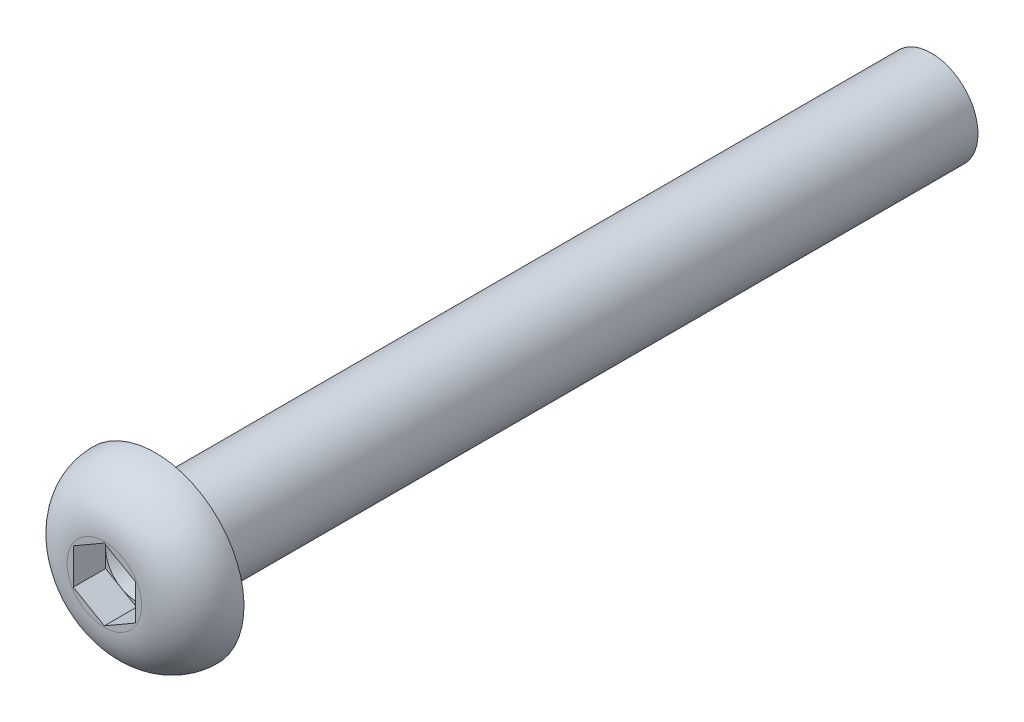
ISO-10303-21;
HEADER;
FILE_DESCRIPTION(('STEP AP214'),'2;1');
FILE_NAME('part.step','',(''),(''),'','','');
FILE_SCHEMA(('AUTOMOTIVE_DESIGN { 1 0 10303 214 1 1 1 1 }'));
ENDSEC;
DATA;
#1=APPLICATION_CONTEXT('core data for automotive mechanical design processes');
#2=APPLICATION_PROTOCOL_DEFINITION('international standard','automotive_design',2000,#1);
#3=PRODUCT_CONTEXT('',#1,'mechanical');
#4=PRODUCT('Part','Part','',(#3));
#5=PRODUCT_RELATED_PRODUCT_CATEGORY('part','',(#4));
#6=PRODUCT_DEFINITION_FORMATION('','',#4);
#7=PRODUCT_DEFINITION_CONTEXT('part definition',#1,'design');
#8=PRODUCT_DEFINITION('design','',#6,#7);
#9=PRODUCT_DEFINITION_SHAPE('','',#8);
#10=(LENGTH_UNIT() NAMED_UNIT(*) SI_UNIT(.MILLI.,.METRE.));
#11=(NAMED_UNIT(*) PLANE_ANGLE_UNIT() SI_UNIT($,.RADIAN.));
#12=(NAMED_UNIT(*) SI_UNIT($,.STERADIAN.) SOLID_ANGLE_UNIT());
#13=UNCERTAINTY_MEASURE_WITH_UNIT(LENGTH_MEASURE(1.E-05),#10,'distance_accuracy_value','');
#14=(GEOMETRIC_REPRESENTATION_CONTEXT(3) GLOBAL_UNCERTAINTY_ASSIGNED_CONTEXT((#13)) GLOBAL_UNIT_ASSIGNED_CONTEXT((#10,
#11,#12)) REPRESENTATION_CONTEXT('',''));
#15=CARTESIAN_POINT('',(0.,0.,0.));
#16=DIRECTION('',(0.,0.,1.));
#17=DIRECTION('',(1.,0.,0.));
#18=AXIS2_PLACEMENT_3D('',#15,#16,#17);
#19=CARTESIAN_POINT('',(0.,0.,-0.1));
#20=DIRECTION('',(0.,0.,-1.));
#21=DIRECTION('',(0.,-1.,0.));
#22=AXIS2_PLACEMENT_3D('',#19,#20,#21);
#23=TOROIDAL_SURFACE('',#22,1.6,0.1);
#24=CARTESIAN_POINT('',(0.,0.,-0.1));
#25=DIRECTION('',(0.,0.,1.));
#26=DIRECTION('',(1.,0.,0.));
#27=AXIS2_PLACEMENT_3D('',#24,#25,#26);
#28=CIRCLE('',#27,1.5);
#29=CARTESIAN_POINT('',(1.5,0.,-0.1));
#30=VERTEX_POINT('',#29);
#31=EDGE_CURVE('E411',#30,#30,#28,.T.);
#32=ORIENTED_EDGE('',*,*,#31,.T.);
#33=EDGE_LOOP('',(#32));
#34=FACE_BOUND('',#33,.T.);
#35=CARTESIAN_POINT('',(0.,0.,0.));
#36=DIRECTION('',(0.,0.,-1.));
#37=DIRECTION('',(0.,-1.,0.));
#38=AXIS2_PLACEMENT_3D('',#35,#36,#37);
#39=CIRCLE('',#38,1.6);
#40=CARTESIAN_POINT('',(0.,-1.6,0.));
#41=VERTEX_POINT('',#40);
#42=EDGE_CURVE('E11',#41,#41,#39,.T.);
#43=ORIENTED_EDGE('',*,*,#42,.T.);
#44=EDGE_LOOP('',(#43));
#45=FACE_BOUND('',#44,.T.);
#46=ADVANCED_FACE('F54',(#34,#45),#23,.F.);
#47=CARTESIAN_POINT('',(0.,0.,0.));
#48=DIRECTION('',(0.,0.,-1.));
#49=DIRECTION('',(0.,-1.,0.));
#50=AXIS2_PLACEMENT_3D('',#47,#48,#49);
#51=PLANE('',#50);
#52=ORIENTED_EDGE('',*,*,#42,.F.);
#53=EDGE_LOOP('',(#52));
#54=FACE_BOUND('',#53,.T.);
#55=CARTESIAN_POINT('',(0.,0.,0.));
#56=DIRECTION('',(0.,0.,-1.));
#57=DIRECTION('',(0.,-1.,0.));
#58=AXIS2_PLACEMENT_3D('',#55,#56,#57);
#59=CIRCLE('',#58,2.85);
#60=CARTESIAN_POINT('',(0.,-2.85,0.));
#61=VERTEX_POINT('',#60);
#62=EDGE_CURVE('E65',#61,#61,#59,.T.);
#63=ORIENTED_EDGE('',*,*,#62,.T.);
#64=EDGE_LOOP('',(#63));
#65=FACE_BOUND('',#64,.T.);
#66=ADVANCED_FACE('F238',(#54,#65),#51,.T.);
#67=CARTESIAN_POINT('',(0.,0.,-2.1325005253703E-13));
#68=DIRECTION('',(0.,0.,-1.));
#69=DIRECTION('',(0.,-1.,0.));
#70=AXIS2_PLACEMENT_3D('',#67,#68,#69);
#71=DEGENERATE_TOROIDAL_SURFACE('',#70,1.19999999999978,1.65000000000022,.T.);
#72=ORIENTED_EDGE('',*,*,#62,.F.);
#73=EDGE_LOOP('',(#72));
#74=FACE_BOUND('',#73,.T.);
#75=CARTESIAN_POINT('',(0.,0.,1.65));
#76=DIRECTION('',(0.,0.,-1.));
#77=DIRECTION('',(0.,-1.,0.));
#78=AXIS2_PLACEMENT_3D('',#75,#76,#77);
#79=CIRCLE('',#78,1.19999999999978);
#80=CARTESIAN_POINT('',(0.,-1.19999999999978,1.65));
#81=VERTEX_POINT('',#80);
#82=EDGE_CURVE('E221',#81,#81,#79,.T.);
#83=ORIENTED_EDGE('',*,*,#82,.T.);
#84=EDGE_LOOP('',(#83));
#85=FACE_BOUND('',#84,.T.);
#86=ADVANCED_FACE('F241',(#74,#85),#71,.T.);
#87=CARTESIAN_POINT('',(0.,0.,1.65));
#88=DIRECTION('',(0.,0.,1.));
#89=DIRECTION('',(0.,-1.,0.));
#90=AXIS2_PLACEMENT_3D('',#87,#88,#89);
#91=PLANE('',#90);
#92=DIRECTION('',(-0.866025403784439,-0.5,0.));
#93=VECTOR('',#92,1.);
#94=CARTESIAN_POINT('',(0.,1.15470053837925,1.65));
#95=LINE('',#94,#93);
#96=CARTESIAN_POINT('',(0.,1.15470053837925,1.65));
#97=VERTEX_POINT('',#96);
#98=CARTESIAN_POINT('',(-1.,0.577350269189626,1.65));
#99=VERTEX_POINT('',#98);
#100=EDGE_CURVE('E206',#97,#99,#95,.T.);
#101=ORIENTED_EDGE('',*,*,#100,.F.);
#102=DIRECTION('',(-0.86602540378444,0.5,0.));
#103=VECTOR('',#102,1.);
#104=CARTESIAN_POINT('',(1.,0.577350269189627,1.65));
#105=LINE('',#104,#103);
#106=CARTESIAN_POINT('',(1.,0.577350269189627,1.65));
#107=VERTEX_POINT('',#106);
#108=EDGE_CURVE('E194',#107,#97,#105,.T.);
#109=ORIENTED_EDGE('',*,*,#108,.F.);
#110=DIRECTION('',(0.,1.,0.));
#111=VECTOR('',#110,1.);
#112=CARTESIAN_POINT('',(1.,-0.577350269189625,1.65));
#113=LINE('',#112,#111);
#114=CARTESIAN_POINT('',(1.,-0.577350269189623,1.65));
#115=VERTEX_POINT('',#114);
#116=EDGE_CURVE('E217',#115,#107,#113,.T.);
#117=ORIENTED_EDGE('',*,*,#116,.F.);
#118=DIRECTION('',(0.866025403784438,0.5,0.));
#119=VECTOR('',#118,1.);
#120=CARTESIAN_POINT('',(0.,-1.15470053837925,1.65));
#121=LINE('',#120,#119);
#122=CARTESIAN_POINT('',(0.,-1.15470053837925,1.65));
#123=VERTEX_POINT('',#122);
#124=EDGE_CURVE('E154',#123,#115,#121,.T.);
#125=ORIENTED_EDGE('',*,*,#124,.F.);
#126=DIRECTION('',(0.866025403784438,-0.5,0.));
#127=VECTOR('',#126,1.);
#128=CARTESIAN_POINT('',(-1.,-0.577350269189625,1.65));
#129=LINE('',#128,#127);
#130=CARTESIAN_POINT('',(-1.,-0.577350269189625,1.65));
#131=VERTEX_POINT('',#130);
#132=EDGE_CURVE('E155',#131,#123,#129,.T.);
#133=ORIENTED_EDGE('',*,*,#132,.F.);
#134=DIRECTION('',(0.,-1.,0.));
#135=VECTOR('',#134,1.);
#136=CARTESIAN_POINT('',(-1.,0.577350269189627,1.65));
#137=LINE('',#136,#135);
#138=EDGE_CURVE('E187',#99,#131,#137,.T.);
#139=ORIENTED_EDGE('',*,*,#138,.F.);
#140=EDGE_LOOP('',(#101,#109,#117,#125,#133,#139));
#141=FACE_BOUND('',#140,.T.);
#142=ORIENTED_EDGE('',*,*,#82,.F.);
#143=EDGE_LOOP('',(#142));
#144=FACE_BOUND('',#143,.T.);
#145=ADVANCED_FACE('F242',(#141,#144),#91,.T.);
#146=CARTESIAN_POINT('',(0.,-1.15470053837925,0.61));
#147=DIRECTION('',(0.5,-0.866025403784438,0.));
#148=DIRECTION('',(0.866025403784438,0.5,0.));
#149=AXIS2_PLACEMENT_3D('',#146,#147,#148);
#150=PLANE('',#149);
#151=ORIENTED_EDGE('',*,*,#124,.T.);
#152=DIRECTION('',(0.,0.,1.));
#153=VECTOR('',#152,1.);
#154=CARTESIAN_POINT('',(1.,-0.577350269189625,0.61));
#155=LINE('',#154,#153);
#156=CARTESIAN_POINT('',(1.,-0.577350269189625,0.61));
#157=VERTEX_POINT('',#156);
#158=EDGE_CURVE('E191',#157,#115,#155,.T.);
#159=ORIENTED_EDGE('',*,*,#158,.F.);
#160=DIRECTION('',(0.866025403784438,0.5,0.));
#161=VECTOR('',#160,1.);
#162=CARTESIAN_POINT('',(0.5,-0.866025403784438,0.61));
#163=LINE('',#162,#161);
#164=CARTESIAN_POINT('',(0.5,-0.866025403784438,0.61));
#165=VERTEX_POINT('',#164);
#166=EDGE_CURVE('E161',#165,#157,#163,.T.);
#167=ORIENTED_EDGE('',*,*,#166,.F.);
#168=DIRECTION('',(0.866025403784438,0.5,0.));
#169=VECTOR('',#168,1.);
#170=CARTESIAN_POINT('',(0.,-1.15470053837925,0.61));
#171=LINE('',#170,#169);
#172=CARTESIAN_POINT('',(0.,-1.15470053837925,0.61));
#173=VERTEX_POINT('',#172);
#174=EDGE_CURVE('E158',#173,#165,#171,.T.);
#175=ORIENTED_EDGE('',*,*,#174,.F.);
#176=DIRECTION('',(0.,0.,1.));
#177=VECTOR('',#176,1.);
#178=CARTESIAN_POINT('',(0.,-1.15470053837925,0.61));
#179=LINE('',#178,#177);
#180=EDGE_CURVE('E146',#173,#123,#179,.T.);
#181=ORIENTED_EDGE('',*,*,#180,.T.);
#182=EDGE_LOOP('',(#151,#159,#167,#175,#181));
#183=FACE_BOUND('',#182,.T.);
#184=ADVANCED_FACE('F157',(#183),#150,.F.);
#185=CARTESIAN_POINT('',(-1.,-0.577350269189625,0.61));
#186=DIRECTION('',(-0.5,-0.866025403784438,0.));
#187=DIRECTION('',(0.866025403784438,-0.5,0.));
#188=AXIS2_PLACEMENT_3D('',#185,#186,#187);
#189=PLANE('',#188);
#190=ORIENTED_EDGE('',*,*,#132,.T.);
#191=ORIENTED_EDGE('',*,*,#180,.F.);
#192=DIRECTION('',(0.866025403784438,-0.5,0.));
#193=VECTOR('',#192,1.);
#194=CARTESIAN_POINT('',(-0.5,-0.866025403784438,0.61));
#195=LINE('',#194,#193);
#196=CARTESIAN_POINT('',(-0.5,-0.866025403784438,0.61));
#197=VERTEX_POINT('',#196);
#198=EDGE_CURVE('E133',#197,#173,#195,.T.);
#199=ORIENTED_EDGE('',*,*,#198,.F.);
#200=DIRECTION('',(0.866025403784438,-0.5,0.));
#201=VECTOR('',#200,1.);
#202=CARTESIAN_POINT('',(-1.,-0.577350269189625,0.61));
#203=LINE('',#202,#201);
#204=CARTESIAN_POINT('',(-1.,-0.577350269189625,0.61));
#205=VERTEX_POINT('',#204);
#206=EDGE_CURVE('E175',#205,#197,#203,.T.);
#207=ORIENTED_EDGE('',*,*,#206,.F.);
#208=DIRECTION('',(0.,0.,1.));
#209=VECTOR('',#208,1.);
#210=CARTESIAN_POINT('',(-1.,-0.577350269189625,0.61));
#211=LINE('',#210,#209);
#212=EDGE_CURVE('E123',#205,#131,#211,.T.);
#213=ORIENTED_EDGE('',*,*,#212,.T.);
#214=EDGE_LOOP('',(#190,#191,#199,#207,#213));
#215=FACE_BOUND('',#214,.T.);
#216=ADVANCED_FACE('F147',(#215),#189,.F.);
#217=CARTESIAN_POINT('',(-1.,0.577350269189627,0.61));
#218=DIRECTION('',(-1.,0.,0.));
#219=DIRECTION('',(0.,-1.,0.));
#220=AXIS2_PLACEMENT_3D('',#217,#218,#219);
#221=PLANE('',#220);
#222=ORIENTED_EDGE('',*,*,#138,.T.);
#223=ORIENTED_EDGE('',*,*,#212,.F.);
#224=DIRECTION('',(0.,-1.,0.));
#225=VECTOR('',#224,1.);
#226=CARTESIAN_POINT('',(-1.,0.,0.61));
#227=LINE('',#226,#225);
#228=CARTESIAN_POINT('',(-1.,0.,0.61));
#229=VERTEX_POINT('',#228);
#230=EDGE_CURVE('E183',#229,#205,#227,.T.);
#231=ORIENTED_EDGE('',*,*,#230,.F.);
#232=DIRECTION('',(0.,-1.,0.));
#233=VECTOR('',#232,1.);
#234=CARTESIAN_POINT('',(-1.,0.577350269189627,0.61));
#235=LINE('',#234,#233);
#236=CARTESIAN_POINT('',(-1.,0.577350269189627,0.61));
#237=VERTEX_POINT('',#236);
#238=EDGE_CURVE('E302',#237,#229,#235,.T.);
#239=ORIENTED_EDGE('',*,*,#238,.F.);
#240=DIRECTION('',(0.,0.,1.));
#241=VECTOR('',#240,1.);
#242=CARTESIAN_POINT('',(-1.,0.577350269189627,0.61));
#243=LINE('',#242,#241);
#244=EDGE_CURVE('E178',#237,#99,#243,.T.);
#245=ORIENTED_EDGE('',*,*,#244,.T.);
#246=EDGE_LOOP('',(#222,#223,#231,#239,#245));
#247=FACE_BOUND('',#246,.T.);
#248=ADVANCED_FACE('F60',(#247),#221,.F.);
#249=CARTESIAN_POINT('',(0.,1.15470053837925,0.61));
#250=DIRECTION('',(-0.5,0.866025403784439,0.));
#251=DIRECTION('',(-0.866025403784439,-0.5,0.));
#252=AXIS2_PLACEMENT_3D('',#249,#250,#251);
#253=PLANE('',#252);
#254=ORIENTED_EDGE('',*,*,#100,.T.);
#255=ORIENTED_EDGE('',*,*,#244,.F.);
#256=DIRECTION('',(-0.866025403784439,-0.5,0.));
#257=VECTOR('',#256,1.);
#258=CARTESIAN_POINT('',(-0.5,0.866025403784439,0.61));
#259=LINE('',#258,#257);
#260=CARTESIAN_POINT('',(-0.5,0.866025403784439,0.61));
#261=VERTEX_POINT('',#260);
#262=EDGE_CURVE('E297',#261,#237,#259,.T.);
#263=ORIENTED_EDGE('',*,*,#262,.F.);
#264=DIRECTION('',(-0.866025403784439,-0.5,0.));
#265=VECTOR('',#264,1.);
#266=CARTESIAN_POINT('',(0.,1.15470053837925,0.61));
#267=LINE('',#266,#265);
#268=CARTESIAN_POINT('',(0.,1.15470053837925,0.61));
#269=VERTEX_POINT('',#268);
#270=EDGE_CURVE('E306',#269,#261,#267,.T.);
#271=ORIENTED_EDGE('',*,*,#270,.F.);
#272=DIRECTION('',(0.,0.,1.));
#273=VECTOR('',#272,1.);
#274=CARTESIAN_POINT('',(0.,1.15470053837925,0.61));
#275=LINE('',#274,#273);
#276=EDGE_CURVE('E209',#269,#97,#275,.T.);
#277=ORIENTED_EDGE('',*,*,#276,.T.);
#278=EDGE_LOOP('',(#254,#255,#263,#271,#277));
#279=FACE_BOUND('',#278,.T.);
#280=ADVANCED_FACE('F278',(#279),#253,.F.);
#281=CARTESIAN_POINT('',(1.,0.577350269189627,0.61));
#282=DIRECTION('',(0.5,0.86602540378444,0.));
#283=DIRECTION('',(-0.86602540378444,0.5,0.));
#284=AXIS2_PLACEMENT_3D('',#281,#282,#283);
#285=PLANE('',#284);
#286=ORIENTED_EDGE('',*,*,#108,.T.);
#287=ORIENTED_EDGE('',*,*,#276,.F.);
#288=DIRECTION('',(-0.86602540378444,0.5,0.));
#289=VECTOR('',#288,1.);
#290=CARTESIAN_POINT('',(0.5,0.86602540378444,0.61));
#291=LINE('',#290,#289);
#292=CARTESIAN_POINT('',(0.5,0.86602540378444,0.61));
#293=VERTEX_POINT('',#292);
#294=EDGE_CURVE('E315',#293,#269,#291,.T.);
#295=ORIENTED_EDGE('',*,*,#294,.F.);
#296=DIRECTION('',(-0.86602540378444,0.5,0.));
#297=VECTOR('',#296,1.);
#298=CARTESIAN_POINT('',(1.,0.577350269189627,0.61));
#299=LINE('',#298,#297);
#300=CARTESIAN_POINT('',(1.,0.577350269189627,0.61));
#301=VERTEX_POINT('',#300);
#302=EDGE_CURVE('E292',#301,#293,#299,.T.);
#303=ORIENTED_EDGE('',*,*,#302,.F.);
#304=DIRECTION('',(0.,0.,1.));
#305=VECTOR('',#304,1.);
#306=CARTESIAN_POINT('',(1.,0.577350269189627,0.61));
#307=LINE('',#306,#305);
#308=EDGE_CURVE('E198',#301,#107,#307,.T.);
#309=ORIENTED_EDGE('',*,*,#308,.T.);
#310=EDGE_LOOP('',(#286,#287,#295,#303,#309));
#311=FACE_BOUND('',#310,.T.);
#312=ADVANCED_FACE('F271',(#311),#285,.F.);
#313=CARTESIAN_POINT('',(1.,-0.577350269189625,0.61));
#314=DIRECTION('',(1.,0.,0.));
#315=DIRECTION('',(0.,1.,0.));
#316=AXIS2_PLACEMENT_3D('',#313,#314,#315);
#317=PLANE('',#316);
#318=ORIENTED_EDGE('',*,*,#116,.T.);
#319=ORIENTED_EDGE('',*,*,#308,.F.);
#320=DIRECTION('',(0.,1.,0.));
#321=VECTOR('',#320,1.);
#322=CARTESIAN_POINT('',(1.,0.,0.61));
#323=LINE('',#322,#321);
#324=CARTESIAN_POINT('',(1.,0.,0.61));
#325=VERTEX_POINT('',#324);
#326=EDGE_CURVE('E346',#325,#301,#323,.T.);
#327=ORIENTED_EDGE('',*,*,#326,.F.);
#328=DIRECTION('',(0.,1.,0.));
#329=VECTOR('',#328,1.);
#330=CARTESIAN_POINT('',(1.,-0.577350269189625,0.61));
#331=LINE('',#330,#329);
#332=EDGE_CURVE('E200',#157,#325,#331,.T.);
#333=ORIENTED_EDGE('',*,*,#332,.F.);
#334=ORIENTED_EDGE('',*,*,#158,.T.);
#335=EDGE_LOOP('',(#318,#319,#327,#333,#334));
#336=FACE_BOUND('',#335,.T.);
#337=ADVANCED_FACE('F268',(#336),#317,.F.);
#338=CARTESIAN_POINT('',(0.,0.,0.321324865405187));
#339=DIRECTION('',(0.,0.,1.));
#340=DIRECTION('',(1.,0.,0.));
#341=AXIS2_PLACEMENT_3D('',#338,#339,#340);
#342=CONICAL_SURFACE('',#341,0.5,1.0471975511966);
#343=CARTESIAN_POINT('',(0.,0.,0.0326497308103757));
#344=VERTEX_POINT('',#343);
#345=VERTEX_LOOP('',#344);
#346=FACE_BOUND('',#345,.T.);
#347=CARTESIAN_POINT('',(0.,0.,0.61));
#348=DIRECTION('',(0.,0.,1.));
#349=DIRECTION('',(1.,0.,0.));
#350=AXIS2_PLACEMENT_3D('',#347,#348,#349);
#351=CIRCLE('',#350,1.);
#352=EDGE_CURVE('E354',#325,#293,#351,.T.);
#353=ORIENTED_EDGE('',*,*,#352,.T.);
#354=CARTESIAN_POINT('',(0.,0.,0.61));
#355=DIRECTION('',(0.,0.,1.));
#356=DIRECTION('',(0.5,0.86602540378444,0.));
#357=AXIS2_PLACEMENT_3D('',#354,#355,#356);
#358=CIRCLE('',#357,1.);
#359=EDGE_CURVE('E360',#293,#261,#358,.T.);
#360=ORIENTED_EDGE('',*,*,#359,.T.);
#361=CARTESIAN_POINT('',(0.,0.,0.61));
#362=DIRECTION('',(0.,0.,1.));
#363=DIRECTION('',(-0.5,0.866025403784439,0.));
#364=AXIS2_PLACEMENT_3D('',#361,#362,#363);
#365=CIRCLE('',#364,1.);
#366=EDGE_CURVE('E304',#261,#229,#365,.T.);
#367=ORIENTED_EDGE('',*,*,#366,.T.);
#368=CARTESIAN_POINT('',(0.,0.,0.61));
#369=DIRECTION('',(0.,0.,1.));
#370=DIRECTION('',(-1.,0.,0.));
#371=AXIS2_PLACEMENT_3D('',#368,#369,#370);
#372=CIRCLE('',#371,1.);
#373=EDGE_CURVE('E321',#229,#197,#372,.T.);
#374=ORIENTED_EDGE('',*,*,#373,.T.);
#375=CARTESIAN_POINT('',(0.,0.,0.61));
#376=DIRECTION('',(0.,0.,1.));
#377=DIRECTION('',(-0.5,-0.866025403784438,0.));
#378=AXIS2_PLACEMENT_3D('',#375,#376,#377);
#379=CIRCLE('',#378,1.);
#380=EDGE_CURVE('E166',#197,#165,#379,.T.);
#381=ORIENTED_EDGE('',*,*,#380,.T.);
#382=CARTESIAN_POINT('',(0.,0.,0.61));
#383=DIRECTION('',(0.,0.,1.));
#384=DIRECTION('',(0.5,-0.866025403784438,0.));
#385=AXIS2_PLACEMENT_3D('',#382,#383,#384);
#386=CIRCLE('',#385,1.);
#387=EDGE_CURVE('E167',#165,#325,#386,.T.);
#388=ORIENTED_EDGE('',*,*,#387,.T.);
#389=EDGE_LOOP('',(#353,#360,#367,#374,#381,#388));
#390=FACE_BOUND('',#389,.T.);
#391=ADVANCED_FACE('F269',(#346,#390),#342,.F.);
#392=CARTESIAN_POINT('',(0.,0.,0.61));
#393=DIRECTION('',(0.,0.,1.));
#394=DIRECTION('',(1.,0.,0.));
#395=AXIS2_PLACEMENT_3D('',#392,#393,#394);
#396=PLANE('',#395);
#397=ORIENTED_EDGE('',*,*,#387,.F.);
#398=ORIENTED_EDGE('',*,*,#166,.T.);
#399=ORIENTED_EDGE('',*,*,#332,.T.);
#400=EDGE_LOOP('',(#397,#398,#399));
#401=FACE_BOUND('',#400,.T.);
#402=ADVANCED_FACE('F280',(#401),#396,.T.);
#403=ORIENTED_EDGE('',*,*,#380,.F.);
#404=ORIENTED_EDGE('',*,*,#198,.T.);
#405=ORIENTED_EDGE('',*,*,#174,.T.);
#406=EDGE_LOOP('',(#403,#404,#405));
#407=FACE_BOUND('',#406,.T.);
#408=ADVANCED_FACE('F169',(#407),#396,.T.);
#409=ORIENTED_EDGE('',*,*,#373,.F.);
#410=ORIENTED_EDGE('',*,*,#230,.T.);
#411=ORIENTED_EDGE('',*,*,#206,.T.);
#412=EDGE_LOOP('',(#409,#410,#411));
#413=FACE_BOUND('',#412,.T.);
#414=ADVANCED_FACE('F387',(#413),#396,.T.);
#415=ORIENTED_EDGE('',*,*,#366,.F.);
#416=ORIENTED_EDGE('',*,*,#262,.T.);
#417=ORIENTED_EDGE('',*,*,#238,.T.);
#418=EDGE_LOOP('',(#415,#416,#417));
#419=FACE_BOUND('',#418,.T.);
#420=ADVANCED_FACE('F376',(#419),#396,.T.);
#421=ORIENTED_EDGE('',*,*,#359,.F.);
#422=ORIENTED_EDGE('',*,*,#294,.T.);
#423=ORIENTED_EDGE('',*,*,#270,.T.);
#424=EDGE_LOOP('',(#421,#422,#423));
#425=FACE_BOUND('',#424,.T.);
#426=ADVANCED_FACE('F381',(#425),#396,.T.);
#427=ORIENTED_EDGE('',*,*,#352,.F.);
#428=ORIENTED_EDGE('',*,*,#326,.T.);
#429=ORIENTED_EDGE('',*,*,#302,.T.);
#430=EDGE_LOOP('',(#427,#428,#429));
#431=FACE_BOUND('',#430,.T.);
#432=ADVANCED_FACE('F402',(#431),#396,.T.);
#433=CARTESIAN_POINT('',(0.,0.,-25.));
#434=DIRECTION('',(0.,0.,1.));
#435=DIRECTION('',(1.,0.,0.));
#436=AXIS2_PLACEMENT_3D('',#433,#434,#435);
#437=CYLINDRICAL_SURFACE('',#436,1.5);
#438=ORIENTED_EDGE('',*,*,#31,.F.);
#439=EDGE_LOOP('',(#438));
#440=FACE_BOUND('',#439,.T.);
#441=CARTESIAN_POINT('',(0.,0.,-25.));
#442=DIRECTION('',(0.,0.,-1.));
#443=DIRECTION('',(-1.,0.,0.));
#444=AXIS2_PLACEMENT_3D('',#441,#442,#443);
#445=CIRCLE('',#444,1.5);
#446=CARTESIAN_POINT('',(-1.5,0.,-25.));
#447=VERTEX_POINT('',#446);
#448=EDGE_CURVE('E412',#447,#447,#445,.T.);
#449=ORIENTED_EDGE('',*,*,#448,.F.);
#450=EDGE_LOOP('',(#449));
#451=FACE_BOUND('',#450,.T.);
#452=ADVANCED_FACE('F421',(#440,#451),#437,.T.);
#453=CARTESIAN_POINT('',(0.,0.,-25.));
#454=DIRECTION('',(0.,0.,-1.));
#455=DIRECTION('',(-1.,0.,0.));
#456=AXIS2_PLACEMENT_3D('',#453,#454,#455);
#457=PLANE('',#456);
#458=ORIENTED_EDGE('',*,*,#448,.T.);
#459=EDGE_LOOP('',(#458));
#460=FACE_BOUND('',#459,.T.);
#461=ADVANCED_FACE('F423',(#460),#457,.T.);
#462=CLOSED_SHELL('',(#46,#66,#86,#145,#184,#216,#248,#280,#312,#337,#391,#402,#408,#414,#420,
#426,#432,#452,#461));
#463=MANIFOLD_SOLID_BREP('B2',#462);
#464=ADVANCED_BREP_SHAPE_REPRESENTATION('',(#18,#463),#14);
#465=SHAPE_DEFINITION_REPRESENTATION(#9,#464);
ENDSEC;
END-ISO-10303-21;
